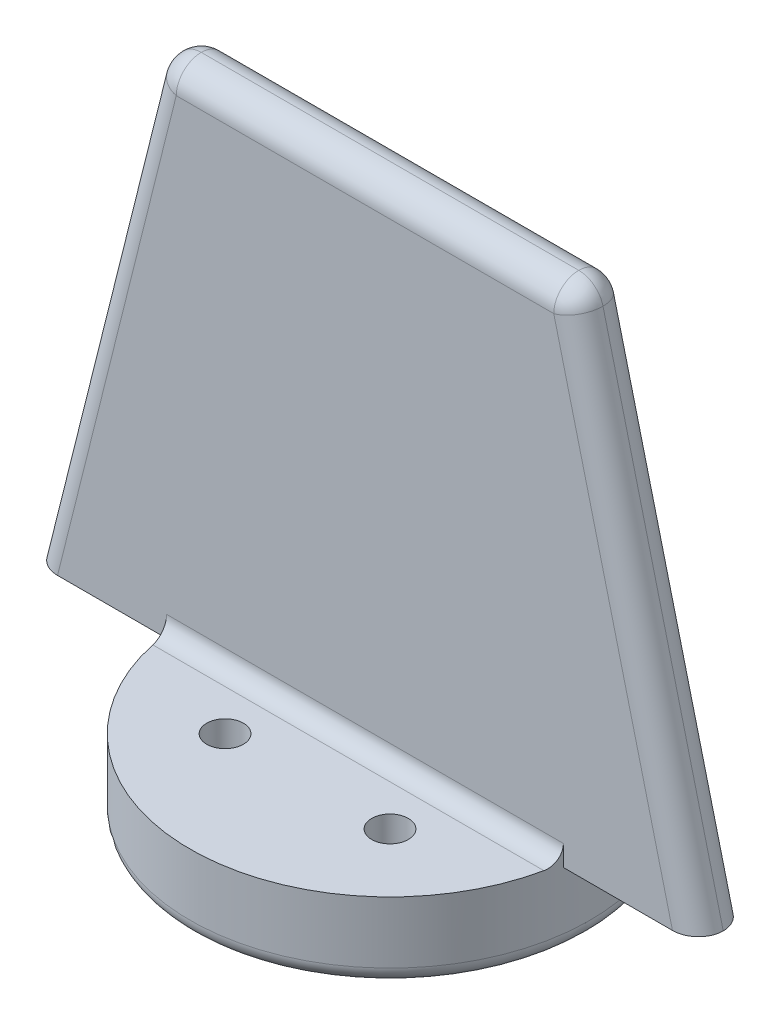
ISO-10303-21;
HEADER;
FILE_DESCRIPTION(('STEP AP214'),'2;1');
FILE_NAME('part.step','',(''),(''),'','','');
FILE_SCHEMA(('AUTOMOTIVE_DESIGN { 1 0 10303 214 1 1 1 1 }'));
ENDSEC;
DATA;
#1=APPLICATION_CONTEXT('core data for automotive mechanical design processes');
#2=APPLICATION_PROTOCOL_DEFINITION('international standard','automotive_design',2000,#1);
#3=PRODUCT_CONTEXT('',#1,'mechanical');
#4=PRODUCT('Part','Part','',(#3));
#5=PRODUCT_RELATED_PRODUCT_CATEGORY('part','',(#4));
#6=PRODUCT_DEFINITION_FORMATION('','',#4);
#7=PRODUCT_DEFINITION_CONTEXT('part definition',#1,'design');
#8=PRODUCT_DEFINITION('design','',#6,#7);
#9=PRODUCT_DEFINITION_SHAPE('','',#8);
#10=(LENGTH_UNIT() NAMED_UNIT(*) SI_UNIT(.MILLI.,.METRE.));
#11=(NAMED_UNIT(*) PLANE_ANGLE_UNIT() SI_UNIT($,.RADIAN.));
#12=(NAMED_UNIT(*) SI_UNIT($,.STERADIAN.) SOLID_ANGLE_UNIT());
#13=UNCERTAINTY_MEASURE_WITH_UNIT(LENGTH_MEASURE(1.E-05),#10,'distance_accuracy_value','');
#14=(GEOMETRIC_REPRESENTATION_CONTEXT(3) GLOBAL_UNCERTAINTY_ASSIGNED_CONTEXT((#13)) GLOBAL_UNIT_ASSIGNED_CONTEXT((#10,
#11,#12)) REPRESENTATION_CONTEXT('',''));
#15=CARTESIAN_POINT('',(0.,0.,0.));
#16=DIRECTION('',(0.,0.,1.));
#17=DIRECTION('',(1.,0.,0.));
#18=AXIS2_PLACEMENT_3D('',#15,#16,#17);
#19=CARTESIAN_POINT('',(0.,0.,0.));
#20=DIRECTION('',(0.,1.,0.));
#21=DIRECTION('',(0.,0.,1.));
#22=AXIS2_PLACEMENT_3D('',#19,#20,#21);
#23=PLANE('',#22);
#24=DIRECTION('',(1.,0.,0.));
#25=VECTOR('',#24,1.);
#26=CARTESIAN_POINT('',(-20.,0.,1.5));
#27=LINE('',#26,#25);
#28=CARTESIAN_POINT('',(11.9058808997907,0.,1.5));
#29=VERTEX_POINT('',#28);
#30=CARTESIAN_POINT('',(18.4538353903934,0.,1.5));
#31=VERTEX_POINT('',#30);
#32=EDGE_CURVE('E178',#29,#31,#27,.T.);
#33=ORIENTED_EDGE('',*,*,#32,.F.);
#34=CARTESIAN_POINT('',(0.,0.,0.));
#35=DIRECTION('',(0.,1.,0.));
#36=DIRECTION('',(0.,0.,1.));
#37=AXIS2_PLACEMENT_3D('',#34,#35,#36);
#38=CIRCLE('',#37,12.);
#39=CARTESIAN_POINT('',(11.9058808997907,0.,-1.5));
#40=VERTEX_POINT('',#39);
#41=EDGE_CURVE('E435',#29,#40,#38,.T.);
#42=ORIENTED_EDGE('',*,*,#41,.T.);
#43=DIRECTION('',(-1.,0.,0.));
#44=VECTOR('',#43,1.);
#45=CARTESIAN_POINT('',(-20.,0.,-1.5));
#46=LINE('',#45,#44);
#47=CARTESIAN_POINT('',(18.4538353903934,0.,-1.5));
#48=VERTEX_POINT('',#47);
#49=EDGE_CURVE('E165',#48,#40,#46,.T.);
#50=ORIENTED_EDGE('',*,*,#49,.F.);
#51=CARTESIAN_POINT('',(18.4538353903934,0.,0.));
#52=DIRECTION('',(0.,1.,0.));
#53=DIRECTION('',(-1.,0.,0.));
#54=AXIS2_PLACEMENT_3D('',#51,#52,#53);
#55=ELLIPSE('',#54,1.54616460960662,1.5);
#56=CARTESIAN_POINT('',(20.,0.,0.));
#57=VERTEX_POINT('',#56);
#58=EDGE_CURVE('E204',#48,#57,#55,.F.);
#59=ORIENTED_EDGE('',*,*,#58,.T.);
#60=CARTESIAN_POINT('',(18.4538353903934,0.,0.));
#61=DIRECTION('',(0.,1.,0.));
#62=DIRECTION('',(-1.,0.,0.));
#63=AXIS2_PLACEMENT_3D('',#60,#61,#62);
#64=ELLIPSE('',#63,1.54616460960662,1.5);
#65=EDGE_CURVE('E190',#57,#31,#64,.F.);
#66=ORIENTED_EDGE('',*,*,#65,.T.);
#67=EDGE_LOOP('',(#33,#42,#50,#59,#66));
#68=FACE_BOUND('',#67,.T.);
#69=ADVANCED_FACE('F56',(#68),#23,.F.);
#70=CARTESIAN_POINT('',(-11.9058808997907,0.,-1.5));
#71=VERTEX_POINT('',#70);
#72=CARTESIAN_POINT('',(-18.4538353903934,0.,-1.5));
#73=VERTEX_POINT('',#72);
#74=EDGE_CURVE('E177',#71,#73,#46,.T.);
#75=ORIENTED_EDGE('',*,*,#74,.F.);
#76=CARTESIAN_POINT('',(-11.9058808997907,0.,1.5));
#77=VERTEX_POINT('',#76);
#78=EDGE_CURVE('E175',#71,#77,#38,.T.);
#79=ORIENTED_EDGE('',*,*,#78,.T.);
#80=CARTESIAN_POINT('',(-18.4538353903934,0.,1.5));
#81=VERTEX_POINT('',#80);
#82=EDGE_CURVE('E157',#81,#77,#27,.T.);
#83=ORIENTED_EDGE('',*,*,#82,.F.);
#84=CARTESIAN_POINT('',(-18.4538353903934,0.,0.));
#85=DIRECTION('',(0.,1.,0.));
#86=DIRECTION('',(1.,0.,0.));
#87=AXIS2_PLACEMENT_3D('',#84,#85,#86);
#88=ELLIPSE('',#87,1.54616460960662,1.5);
#89=CARTESIAN_POINT('',(-20.,0.,0.));
#90=VERTEX_POINT('',#89);
#91=EDGE_CURVE('E172',#81,#90,#88,.F.);
#92=ORIENTED_EDGE('',*,*,#91,.T.);
#93=CARTESIAN_POINT('',(-18.4538353903934,0.,0.));
#94=DIRECTION('',(0.,1.,0.));
#95=DIRECTION('',(1.,0.,0.));
#96=AXIS2_PLACEMENT_3D('',#93,#94,#95);
#97=ELLIPSE('',#96,1.54616460960662,1.5);
#98=EDGE_CURVE('E185',#90,#73,#97,.F.);
#99=ORIENTED_EDGE('',*,*,#98,.T.);
#100=EDGE_LOOP('',(#75,#79,#83,#92,#99));
#101=FACE_BOUND('',#100,.T.);
#102=ADVANCED_FACE('F170',(#101),#23,.F.);
#103=CARTESIAN_POINT('',(0.,0.,-1.5));
#104=DIRECTION('',(0.,0.,1.));
#105=DIRECTION('',(1.,0.,0.));
#106=AXIS2_PLACEMENT_3D('',#103,#104,#105);
#107=PLANE('',#106);
#108=DIRECTION('',(0.,-1.,0.));
#109=VECTOR('',#108,1.);
#110=CARTESIAN_POINT('',(11.9058808997907,0.25,-1.5));
#111=LINE('',#110,#109);
#112=CARTESIAN_POINT('',(11.9058808997907,1.25,-1.5));
#113=VERTEX_POINT('',#112);
#114=EDGE_CURVE('E216',#40,#113,#111,.F.);
#115=ORIENTED_EDGE('',*,*,#114,.T.);
#116=DIRECTION('',(1.,0.,0.));
#117=VECTOR('',#116,1.);
#118=CARTESIAN_POINT('',(-11.9058808997907,1.25,-1.5));
#119=LINE('',#118,#117);
#120=CARTESIAN_POINT('',(-11.9058808997907,1.25,-1.5));
#121=VERTEX_POINT('',#120);
#122=EDGE_CURVE('E447',#113,#121,#119,.F.);
#123=ORIENTED_EDGE('',*,*,#122,.T.);
#124=DIRECTION('',(0.,-1.,0.));
#125=VECTOR('',#124,1.);
#126=CARTESIAN_POINT('',(-11.9058808997907,0.25,-1.5));
#127=LINE('',#126,#125);
#128=EDGE_CURVE('E429',#121,#71,#127,.T.);
#129=ORIENTED_EDGE('',*,*,#128,.T.);
#130=ORIENTED_EDGE('',*,*,#74,.T.);
#131=DIRECTION('',(0.242535625036333,0.970142500145332,0.));
#132=VECTOR('',#131,1.);
#133=CARTESIAN_POINT('',(-17.3683156615467,4.34207891538668,-1.5));
#134=LINE('',#133,#132);
#135=CARTESIAN_POINT('',(-11.3288353903934,28.5,-1.5));
#136=VERTEX_POINT('',#135);
#137=EDGE_CURVE('E514',#73,#136,#134,.T.);
#138=ORIENTED_EDGE('',*,*,#137,.T.);
#139=DIRECTION('',(-1.,0.,0.));
#140=VECTOR('',#139,1.);
#141=CARTESIAN_POINT('',(12.5,28.5,-1.5));
#142=LINE('',#141,#140);
#143=CARTESIAN_POINT('',(11.3288353903934,28.5,-1.5));
#144=VERTEX_POINT('',#143);
#145=EDGE_CURVE('E192',#136,#144,#142,.F.);
#146=ORIENTED_EDGE('',*,*,#145,.T.);
#147=DIRECTION('',(-0.242535625036333,0.970142500145332,0.));
#148=VECTOR('',#147,1.);
#149=CARTESIAN_POINT('',(17.3683156615467,4.34207891538668,-1.5));
#150=LINE('',#149,#148);
#151=EDGE_CURVE('E186',#144,#48,#150,.F.);
#152=ORIENTED_EDGE('',*,*,#151,.T.);
#153=ORIENTED_EDGE('',*,*,#49,.T.);
#154=EDGE_LOOP('',(#115,#123,#129,#130,#138,#146,#152,#153));
#155=FACE_BOUND('',#154,.T.);
#156=ADVANCED_FACE('F302',(#155),#107,.F.);
#157=CARTESIAN_POINT('',(0.,0.,1.5));
#158=DIRECTION('',(0.,0.,-1.));
#159=DIRECTION('',(-1.,0.,0.));
#160=AXIS2_PLACEMENT_3D('',#157,#158,#159);
#161=PLANE('',#160);
#162=DIRECTION('',(0.,-1.,0.));
#163=VECTOR('',#162,1.);
#164=CARTESIAN_POINT('',(-11.9058808997907,0.25,1.5));
#165=LINE('',#164,#163);
#166=CARTESIAN_POINT('',(-11.9058808997907,1.25,1.5));
#167=VERTEX_POINT('',#166);
#168=EDGE_CURVE('E75',#77,#167,#165,.F.);
#169=ORIENTED_EDGE('',*,*,#168,.T.);
#170=DIRECTION('',(-1.,0.,0.));
#171=VECTOR('',#170,1.);
#172=CARTESIAN_POINT('',(11.9058808997907,1.25,1.5));
#173=LINE('',#172,#171);
#174=CARTESIAN_POINT('',(11.9058808997907,1.25,1.5));
#175=VERTEX_POINT('',#174);
#176=EDGE_CURVE('E455',#167,#175,#173,.F.);
#177=ORIENTED_EDGE('',*,*,#176,.T.);
#178=DIRECTION('',(0.,-1.,0.));
#179=VECTOR('',#178,1.);
#180=CARTESIAN_POINT('',(11.9058808997907,0.25,1.5));
#181=LINE('',#180,#179);
#182=EDGE_CURVE('E82',#175,#29,#181,.T.);
#183=ORIENTED_EDGE('',*,*,#182,.T.);
#184=ORIENTED_EDGE('',*,*,#32,.T.);
#185=DIRECTION('',(-0.242535625036333,0.970142500145332,0.));
#186=VECTOR('',#185,1.);
#187=CARTESIAN_POINT('',(17.3683156615467,4.34207891538668,1.5));
#188=LINE('',#187,#186);
#189=CARTESIAN_POINT('',(11.3288353903934,28.5,1.5));
#190=VERTEX_POINT('',#189);
#191=EDGE_CURVE('E511',#31,#190,#188,.T.);
#192=ORIENTED_EDGE('',*,*,#191,.T.);
#193=DIRECTION('',(1.,0.,0.));
#194=VECTOR('',#193,1.);
#195=CARTESIAN_POINT('',(-12.5,28.5,1.5));
#196=LINE('',#195,#194);
#197=CARTESIAN_POINT('',(-11.3288353903934,28.5,1.5));
#198=VERTEX_POINT('',#197);
#199=EDGE_CURVE('E160',#190,#198,#196,.F.);
#200=ORIENTED_EDGE('',*,*,#199,.T.);
#201=DIRECTION('',(0.242535625036333,0.970142500145332,0.));
#202=VECTOR('',#201,1.);
#203=CARTESIAN_POINT('',(-17.3683156615467,4.34207891538668,1.5));
#204=LINE('',#203,#202);
#205=EDGE_CURVE('E154',#198,#81,#204,.F.);
#206=ORIENTED_EDGE('',*,*,#205,.T.);
#207=ORIENTED_EDGE('',*,*,#82,.T.);
#208=EDGE_LOOP('',(#169,#177,#183,#184,#192,#200,#206,#207));
#209=FACE_BOUND('',#208,.T.);
#210=ADVANCED_FACE('F156',(#209),#161,.F.);
#211=CARTESIAN_POINT('',(-17.3683156615467,4.34207891538668,0.));
#212=DIRECTION('',(0.242535625036333,0.970142500145332,0.));
#213=DIRECTION('',(-0.970142500145332,0.242535625036333,0.));
#214=AXIS2_PLACEMENT_3D('',#211,#212,#213);
#215=CYLINDRICAL_SURFACE('',#214,1.5);
#216=ORIENTED_EDGE('',*,*,#137,.F.);
#217=ORIENTED_EDGE('',*,*,#98,.F.);
#218=DIRECTION('',(0.242535625036333,0.970142500145332,0.));
#219=VECTOR('',#218,1.);
#220=CARTESIAN_POINT('',(-18.8235294117647,4.70588235294118,0.));
#221=LINE('',#220,#219);
#222=CARTESIAN_POINT('',(-12.7840491406114,28.8638034375545,0.));
#223=VERTEX_POINT('',#222);
#224=EDGE_CURVE('E183',#223,#90,#221,.F.);
#225=ORIENTED_EDGE('',*,*,#224,.F.);
#226=CARTESIAN_POINT('',(-11.3288353903934,28.5,0.));
#227=DIRECTION('',(0.242535625036332,0.970142500145332,0.));
#228=DIRECTION('',(-0.970142500145332,0.242535625036332,0.));
#229=AXIS2_PLACEMENT_3D('',#226,#227,#228);
#230=CIRCLE('',#229,1.5);
#231=EDGE_CURVE('E248',#136,#223,#230,.T.);
#232=ORIENTED_EDGE('',*,*,#231,.F.);
#233=EDGE_LOOP('',(#216,#217,#225,#232));
#234=FACE_BOUND('',#233,.T.);
#235=ADVANCED_FACE('F301',(#234),#215,.T.);
#236=CARTESIAN_POINT('',(17.3683156615467,4.34207891538668,0.));
#237=DIRECTION('',(-0.242535625036333,0.970142500145332,0.));
#238=DIRECTION('',(-0.970142500145332,-0.242535625036333,0.));
#239=AXIS2_PLACEMENT_3D('',#236,#237,#238);
#240=CYLINDRICAL_SURFACE('',#239,1.5);
#241=ORIENTED_EDGE('',*,*,#58,.F.);
#242=ORIENTED_EDGE('',*,*,#151,.F.);
#243=CARTESIAN_POINT('',(11.3288353903934,28.5,0.));
#244=DIRECTION('',(-0.242535625036333,0.970142500145332,0.));
#245=DIRECTION('',(-0.970142500145332,-0.242535625036333,0.));
#246=AXIS2_PLACEMENT_3D('',#243,#244,#245);
#247=CIRCLE('',#246,1.5);
#248=CARTESIAN_POINT('',(12.7840491406114,28.8638034375545,0.));
#249=VERTEX_POINT('',#248);
#250=EDGE_CURVE('E264',#249,#144,#247,.T.);
#251=ORIENTED_EDGE('',*,*,#250,.F.);
#252=DIRECTION('',(-0.242535625036333,0.970142500145332,0.));
#253=VECTOR('',#252,1.);
#254=CARTESIAN_POINT('',(18.8235294117647,4.70588235294118,0.));
#255=LINE('',#254,#253);
#256=EDGE_CURVE('E233',#57,#249,#255,.T.);
#257=ORIENTED_EDGE('',*,*,#256,.F.);
#258=EDGE_LOOP('',(#241,#242,#251,#257));
#259=FACE_BOUND('',#258,.T.);
#260=ADVANCED_FACE('F336',(#259),#240,.T.);
#261=CARTESIAN_POINT('',(-17.3683156615467,4.34207891538668,0.));
#262=DIRECTION('',(0.242535625036333,0.970142500145332,0.));
#263=DIRECTION('',(-0.970142500145332,0.242535625036333,0.));
#264=AXIS2_PLACEMENT_3D('',#261,#262,#263);
#265=CYLINDRICAL_SURFACE('',#264,1.5);
#266=CARTESIAN_POINT('',(-11.3288353903934,28.5,0.));
#267=DIRECTION('',(0.242535625036333,0.970142500145332,0.));
#268=DIRECTION('',(-0.970142500145332,0.242535625036333,0.));
#269=AXIS2_PLACEMENT_3D('',#266,#267,#268);
#270=CIRCLE('',#269,1.5);
#271=EDGE_CURVE('E238',#223,#198,#270,.T.);
#272=ORIENTED_EDGE('',*,*,#271,.F.);
#273=ORIENTED_EDGE('',*,*,#224,.T.);
#274=ORIENTED_EDGE('',*,*,#91,.F.);
#275=ORIENTED_EDGE('',*,*,#205,.F.);
#276=EDGE_LOOP('',(#272,#273,#274,#275));
#277=FACE_BOUND('',#276,.T.);
#278=ADVANCED_FACE('F182',(#277),#265,.T.);
#279=CARTESIAN_POINT('',(-11.3288353903934,28.5,0.));
#280=DIRECTION('',(0.,0.,-1.));
#281=DIRECTION('',(-1.,0.,0.));
#282=AXIS2_PLACEMENT_3D('',#279,#280,#281);
#283=SPHERICAL_SURFACE('',#282,1.5);
#284=ORIENTED_EDGE('',*,*,#231,.T.);
#285=CARTESIAN_POINT('',(-11.3288353903934,28.5,0.));
#286=DIRECTION('',(0.,0.,1.));
#287=DIRECTION('',(1.,0.,0.));
#288=AXIS2_PLACEMENT_3D('',#285,#286,#287);
#289=CIRCLE('',#288,1.5);
#290=CARTESIAN_POINT('',(-11.3288353903934,30.,0.));
#291=VERTEX_POINT('',#290);
#292=EDGE_CURVE('E232',#291,#223,#289,.T.);
#293=ORIENTED_EDGE('',*,*,#292,.F.);
#294=CARTESIAN_POINT('',(-11.3288353903934,28.5,0.));
#295=DIRECTION('',(-1.,0.,0.));
#296=DIRECTION('',(0.,0.,1.));
#297=AXIS2_PLACEMENT_3D('',#294,#295,#296);
#298=CIRCLE('',#297,1.5);
#299=EDGE_CURVE('E228',#136,#291,#298,.F.);
#300=ORIENTED_EDGE('',*,*,#299,.F.);
#301=EDGE_LOOP('',(#284,#293,#300));
#302=FACE_BOUND('',#301,.T.);
#303=ADVANCED_FACE('F329',(#302),#283,.T.);
#304=CARTESIAN_POINT('',(11.3288353903934,28.5,0.));
#305=DIRECTION('',(0.,0.,-1.));
#306=DIRECTION('',(-1.,0.,0.));
#307=AXIS2_PLACEMENT_3D('',#304,#305,#306);
#308=SPHERICAL_SURFACE('',#307,1.5);
#309=CARTESIAN_POINT('',(11.3288353903934,28.5,0.));
#310=DIRECTION('',(0.,0.,-1.));
#311=DIRECTION('',(-1.,0.,0.));
#312=AXIS2_PLACEMENT_3D('',#309,#310,#311);
#313=CIRCLE('',#312,1.5);
#314=CARTESIAN_POINT('',(11.3288353903934,30.,0.));
#315=VERTEX_POINT('',#314);
#316=EDGE_CURVE('E237',#249,#315,#313,.F.);
#317=ORIENTED_EDGE('',*,*,#316,.F.);
#318=ORIENTED_EDGE('',*,*,#250,.T.);
#319=CARTESIAN_POINT('',(11.3288353903934,28.5,0.));
#320=DIRECTION('',(1.,0.,0.));
#321=DIRECTION('',(0.,1.,0.));
#322=AXIS2_PLACEMENT_3D('',#319,#320,#321);
#323=CIRCLE('',#322,1.5);
#324=EDGE_CURVE('E224',#315,#144,#323,.F.);
#325=ORIENTED_EDGE('',*,*,#324,.F.);
#326=EDGE_LOOP('',(#317,#318,#325));
#327=FACE_BOUND('',#326,.T.);
#328=ADVANCED_FACE('F325',(#327),#308,.T.);
#329=CARTESIAN_POINT('',(17.3683156615467,4.34207891538668,0.));
#330=DIRECTION('',(-0.242535625036333,0.970142500145332,0.));
#331=DIRECTION('',(-0.970142500145332,-0.242535625036333,0.));
#332=AXIS2_PLACEMENT_3D('',#329,#330,#331);
#333=CYLINDRICAL_SURFACE('',#332,1.5);
#334=ORIENTED_EDGE('',*,*,#65,.F.);
#335=ORIENTED_EDGE('',*,*,#256,.T.);
#336=CARTESIAN_POINT('',(11.3288353903934,28.5,0.));
#337=DIRECTION('',(-0.242535625036332,0.970142500145332,0.));
#338=DIRECTION('',(-0.970142500145332,-0.242535625036332,0.));
#339=AXIS2_PLACEMENT_3D('',#336,#337,#338);
#340=CIRCLE('',#339,1.5);
#341=EDGE_CURVE('E223',#190,#249,#340,.T.);
#342=ORIENTED_EDGE('',*,*,#341,.F.);
#343=ORIENTED_EDGE('',*,*,#191,.F.);
#344=EDGE_LOOP('',(#334,#335,#342,#343));
#345=FACE_BOUND('',#344,.T.);
#346=ADVANCED_FACE('F321',(#345),#333,.T.);
#347=CARTESIAN_POINT('',(-11.3288353903934,28.5,0.));
#348=DIRECTION('',(0.,0.,1.));
#349=DIRECTION('',(1.,0.,0.));
#350=AXIS2_PLACEMENT_3D('',#347,#348,#349);
#351=SPHERICAL_SURFACE('',#350,1.5);
#352=ORIENTED_EDGE('',*,*,#292,.T.);
#353=ORIENTED_EDGE('',*,*,#271,.T.);
#354=CARTESIAN_POINT('',(-11.3288353903934,28.5,0.));
#355=DIRECTION('',(-1.,0.,0.));
#356=DIRECTION('',(0.,-1.,0.));
#357=AXIS2_PLACEMENT_3D('',#354,#355,#356);
#358=CIRCLE('',#357,1.5);
#359=EDGE_CURVE('E220',#291,#198,#358,.F.);
#360=ORIENTED_EDGE('',*,*,#359,.F.);
#361=EDGE_LOOP('',(#352,#353,#360));
#362=FACE_BOUND('',#361,.T.);
#363=ADVANCED_FACE('F317',(#362),#351,.T.);
#364=CARTESIAN_POINT('',(0.,28.5,0.));
#365=DIRECTION('',(1.,0.,0.));
#366=DIRECTION('',(0.,0.,-1.));
#367=AXIS2_PLACEMENT_3D('',#364,#365,#366);
#368=CYLINDRICAL_SURFACE('',#367,1.5);
#369=ORIENTED_EDGE('',*,*,#145,.F.);
#370=ORIENTED_EDGE('',*,*,#299,.T.);
#371=DIRECTION('',(-1.,0.,0.));
#372=VECTOR('',#371,1.);
#373=CARTESIAN_POINT('',(-12.5,30.,0.));
#374=LINE('',#373,#372);
#375=EDGE_CURVE('E215',#315,#291,#374,.T.);
#376=ORIENTED_EDGE('',*,*,#375,.F.);
#377=ORIENTED_EDGE('',*,*,#324,.T.);
#378=EDGE_LOOP('',(#369,#370,#376,#377));
#379=FACE_BOUND('',#378,.T.);
#380=ADVANCED_FACE('F313',(#379),#368,.T.);
#381=CARTESIAN_POINT('',(11.3288353903934,28.5,0.));
#382=DIRECTION('',(0.,0.,1.));
#383=DIRECTION('',(1.,0.,0.));
#384=AXIS2_PLACEMENT_3D('',#381,#382,#383);
#385=SPHERICAL_SURFACE('',#384,1.5);
#386=ORIENTED_EDGE('',*,*,#341,.T.);
#387=ORIENTED_EDGE('',*,*,#316,.T.);
#388=CARTESIAN_POINT('',(11.3288353903934,28.5,0.));
#389=DIRECTION('',(1.,0.,0.));
#390=DIRECTION('',(0.,0.,-1.));
#391=AXIS2_PLACEMENT_3D('',#388,#389,#390);
#392=CIRCLE('',#391,1.5);
#393=EDGE_CURVE('E211',#190,#315,#392,.F.);
#394=ORIENTED_EDGE('',*,*,#393,.F.);
#395=EDGE_LOOP('',(#386,#387,#394));
#396=FACE_BOUND('',#395,.T.);
#397=ADVANCED_FACE('F309',(#396),#385,.T.);
#398=CARTESIAN_POINT('',(0.,28.5,0.));
#399=DIRECTION('',(-1.,0.,0.));
#400=DIRECTION('',(0.,0.,1.));
#401=AXIS2_PLACEMENT_3D('',#398,#399,#400);
#402=CYLINDRICAL_SURFACE('',#401,1.5);
#403=ORIENTED_EDGE('',*,*,#359,.T.);
#404=ORIENTED_EDGE('',*,*,#199,.F.);
#405=ORIENTED_EDGE('',*,*,#393,.T.);
#406=ORIENTED_EDGE('',*,*,#375,.T.);
#407=EDGE_LOOP('',(#403,#404,#405,#406));
#408=FACE_BOUND('',#407,.T.);
#409=ADVANCED_FACE('F305',(#408),#402,.T.);
#410=CARTESIAN_POINT('',(0.,0.25,0.));
#411=DIRECTION('',(0.,-1.,0.));
#412=DIRECTION('',(0.,0.,-1.));
#413=AXIS2_PLACEMENT_3D('',#410,#411,#412);
#414=CYLINDRICAL_SURFACE('',#413,12.);
#415=CARTESIAN_POINT('',(0.,-3.45,0.));
#416=DIRECTION('',(0.,-1.,0.));
#417=DIRECTION('',(0.,0.,-1.));
#418=AXIS2_PLACEMENT_3D('',#415,#416,#417);
#419=CIRCLE('',#418,12.);
#420=CARTESIAN_POINT('',(0.,-3.45,-12.));
#421=VERTEX_POINT('',#420);
#422=EDGE_CURVE('E464',#421,#421,#419,.F.);
#423=ORIENTED_EDGE('',*,*,#422,.T.);
#424=EDGE_LOOP('',(#423));
#425=FACE_BOUND('',#424,.T.);
#426=ORIENTED_EDGE('',*,*,#114,.F.);
#427=ORIENTED_EDGE('',*,*,#41,.F.);
#428=ORIENTED_EDGE('',*,*,#182,.F.);
#429=CARTESIAN_POINT('',(11.9058808997907,1.25,1.5));
#430=CARTESIAN_POINT('',(11.9058803219719,1.22205934163317,1.50000007829664));
#431=CARTESIAN_POINT('',(11.9057333343807,1.19413208963107,1.50117176931848));
#432=CARTESIAN_POINT('',(11.9051433358163,1.13847795305902,1.50584539028658));
#433=CARTESIAN_POINT('',(11.9047003408256,1.11075105775283,1.50934719442226));
#434=CARTESIAN_POINT('',(11.9029246155717,1.02822425267649,1.52331197780174));
#435=CARTESIAN_POINT('',(11.9011451638572,0.973978019289925,1.53723443440069));
#436=CARTESIAN_POINT('',(11.8963514930938,0.868614891744787,1.57389925906644));
#437=CARTESIAN_POINT('',(11.8933367150576,0.817499426316313,1.59664561971723));
#438=CARTESIAN_POINT('',(11.8860134200411,0.719837555240657,1.65027711057949));
#439=CARTESIAN_POINT('',(11.8817050959263,0.673290469827585,1.68116102741113));
#440=CARTESIAN_POINT('',(11.8717306452732,0.585985730172737,1.75020757404077));
#441=CARTESIAN_POINT('',(11.8660621287416,0.545238469852109,1.78838299136852));
#442=CARTESIAN_POINT('',(11.8533401509418,0.470735715161327,1.87084581994263));
#443=CARTESIAN_POINT('',(11.8462864821446,0.436981270041609,1.9151341467535));
#444=CARTESIAN_POINT('',(11.8307571284401,0.377142833224259,2.00884418399206));
#445=CARTESIAN_POINT('',(11.8222716447478,0.351115361333545,2.05830030663343));
#446=CARTESIAN_POINT('',(11.8039961628101,0.307703492596219,2.16064144415876));
#447=CARTESIAN_POINT('',(11.7942065003078,0.290316876709795,2.2135255747556));
#448=CARTESIAN_POINT('',(11.7765010506871,0.268301412520571,2.30554488053525));
#449=CARTESIAN_POINT('',(11.7688660812159,0.261434373237741,2.34421555548668));
#450=CARTESIAN_POINT('',(11.753119583035,0.252284076838309,2.42193491998216));
#451=CARTESIAN_POINT('',(11.7450088349627,0.249993516025315,2.46098290711082));
#452=CARTESIAN_POINT('',(11.7366945943055,0.25,2.5));
#453=B_SPLINE_CURVE_WITH_KNOTS('',3,(#429,#430,#431,#432,#433,#434,#435,#436,#437,#438,#439,
#440,#441,#442,#443,#444,#445,#446,#447,#448,#449,#450,#451,#452),.UNSPECIFIED.,.F.,.F.,(4,2,2,
2,2,2,2,2,2,2,2,4),(0.,0.0837704102948457,0.167536297913176,0.33477129233307,0.502082044605907,
0.669367863505841,0.836949800798664,1.00455686506324,1.17336130126301,1.3421223647258,
1.46190144896381,1.58148922210985),.UNSPECIFIED.);
#454=CARTESIAN_POINT('',(11.7366945943055,0.25,2.5));
#455=VERTEX_POINT('',#454);
#456=EDGE_CURVE('E12',#175,#455,#453,.T.);
#457=ORIENTED_EDGE('',*,*,#456,.T.);
#458=CARTESIAN_POINT('',(0.,0.25,0.));
#459=DIRECTION('',(0.,-1.,0.));
#460=DIRECTION('',(0.,0.,-1.));
#461=AXIS2_PLACEMENT_3D('',#458,#459,#460);
#462=CIRCLE('',#461,12.);
#463=CARTESIAN_POINT('',(-11.7366945943055,0.25,2.5));
#464=VERTEX_POINT('',#463);
#465=EDGE_CURVE('E426',#455,#464,#462,.T.);
#466=ORIENTED_EDGE('',*,*,#465,.T.);
#467=CARTESIAN_POINT('',(-11.7366945943055,0.25,2.5));
#468=CARTESIAN_POINT('',(-11.7427049934861,0.250000467923372,2.47178579174582));
#469=CARTESIAN_POINT('',(-11.7486097458622,0.251194854573783,2.44356225060722));
#470=CARTESIAN_POINT('',(-11.7601777595555,0.255972685126126,2.38726687335702));
#471=CARTESIAN_POINT('',(-11.765841007387,0.259556262255696,2.35919504579336));
#472=CARTESIAN_POINT('',(-11.7824119298979,0.273883527920906,2.27551932595292));
#473=CARTESIAN_POINT('',(-11.7929120680015,0.288203751443974,2.22040211675762));
#474=CARTESIAN_POINT('',(-11.812600822398,0.326097267212637,2.11316006706677));
#475=CARTESIAN_POINT('',(-11.8217881311987,0.349679697614094,2.06103824023027));
#476=CARTESIAN_POINT('',(-11.8387247513433,0.405498719299101,1.96141501083505));
#477=CARTESIAN_POINT('',(-11.8464747283362,0.437731287570015,1.91391147435382));
#478=CARTESIAN_POINT('',(-11.8604000194753,0.509459065690689,1.82561923779759));
#479=CARTESIAN_POINT('',(-11.8665960656893,0.548845041553487,1.78474502491754));
#480=CARTESIAN_POINT('',(-11.8775754292808,0.634085708292833,1.71015411801405));
#481=CARTESIAN_POINT('',(-11.882358452047,0.679941745217686,1.67643891703542));
#482=CARTESIAN_POINT('',(-11.8905119528114,0.776187407026471,1.61759094957577));
#483=CARTESIAN_POINT('',(-11.8938991276078,0.826514129477812,1.59235744378236));
#484=CARTESIAN_POINT('',(-11.8994050775472,0.930731157378293,1.550678517099));
#485=CARTESIAN_POINT('',(-11.9015247433083,0.984618931010663,1.53422692645111));
#486=CARTESIAN_POINT('',(-11.9039887669093,1.07406597340965,1.51496100709254));
#487=CARTESIAN_POINT('',(-11.9046997173841,1.10903878353772,1.50935374466898));
#488=CARTESIAN_POINT('',(-11.9056448213656,1.17933595376875,1.50187408450956));
#489=CARTESIAN_POINT('',(-11.9058796721771,1.21465972348248,1.4999962247008));
#490=CARTESIAN_POINT('',(-11.9058808997907,1.25,1.5));
#491=B_SPLINE_CURVE_WITH_KNOTS('',3,(#467,#468,#469,#470,#471,#472,#473,#474,#475,#476,#477,
#478,#479,#480,#481,#482,#483,#484,#485,#486,#487,#488,#489,#490),.UNSPECIFIED.,.F.,.F.,(4,2,2,
2,2,2,2,2,2,2,2,4),(0.,0.0864908144352909,0.172986452232615,0.34581696934616,0.518818432287309,
0.691739574598013,0.862213588230627,1.03272312015741,1.20112931084527,1.36941703107628,
1.47551046211687,1.58144839407905),.UNSPECIFIED.);
#492=EDGE_CURVE('E67',#464,#167,#491,.T.);
#493=ORIENTED_EDGE('',*,*,#492,.T.);
#494=ORIENTED_EDGE('',*,*,#168,.F.);
#495=ORIENTED_EDGE('',*,*,#78,.F.);
#496=ORIENTED_EDGE('',*,*,#128,.F.);
#497=CARTESIAN_POINT('',(-11.9058808997907,1.25,-1.5));
#498=CARTESIAN_POINT('',(-11.9058803219719,1.22205934163317,-1.50000007829664));
#499=CARTESIAN_POINT('',(-11.9057333343807,1.19413208963107,-1.50117176931848));
#500=CARTESIAN_POINT('',(-11.9051433358163,1.13847795305902,-1.50584539028658));
#501=CARTESIAN_POINT('',(-11.9047003408256,1.11075105775283,-1.50934719442226));
#502=CARTESIAN_POINT('',(-11.9029246155717,1.02822425267649,-1.52331197780174));
#503=CARTESIAN_POINT('',(-11.9011451638572,0.973978019289925,-1.53723443440069));
#504=CARTESIAN_POINT('',(-11.8963514930938,0.868614891744787,-1.57389925906644));
#505=CARTESIAN_POINT('',(-11.8933367150576,0.817499426316313,-1.59664561971723));
#506=CARTESIAN_POINT('',(-11.8860134200411,0.719837555240657,-1.65027711057949));
#507=CARTESIAN_POINT('',(-11.8817050959263,0.673290469827585,-1.68116102741113));
#508=CARTESIAN_POINT('',(-11.8717306452732,0.585985730172737,-1.75020757404077));
#509=CARTESIAN_POINT('',(-11.8660621287416,0.545238469852109,-1.78838299136852));
#510=CARTESIAN_POINT('',(-11.8533401509418,0.470735715161327,-1.87084581994263));
#511=CARTESIAN_POINT('',(-11.8462864821446,0.436981270041609,-1.9151341467535));
#512=CARTESIAN_POINT('',(-11.8307571284401,0.377142833224259,-2.00884418399206));
#513=CARTESIAN_POINT('',(-11.8222716447478,0.351115361333545,-2.05830030663343));
#514=CARTESIAN_POINT('',(-11.8039961628101,0.307703492596219,-2.16064144415876));
#515=CARTESIAN_POINT('',(-11.7942065003078,0.290316876709795,-2.2135255747556));
#516=CARTESIAN_POINT('',(-11.7765010506871,0.268301412520571,-2.30554488053525));
#517=CARTESIAN_POINT('',(-11.7688660812159,0.261434373237741,-2.34421555548668));
#518=CARTESIAN_POINT('',(-11.753119583035,0.252284076838309,-2.42193491998216));
#519=CARTESIAN_POINT('',(-11.7450088349627,0.249993516025315,-2.46098290711082));
#520=CARTESIAN_POINT('',(-11.7366945943055,0.25,-2.5));
#521=B_SPLINE_CURVE_WITH_KNOTS('',3,(#497,#498,#499,#500,#501,#502,#503,#504,#505,#506,#507,
#508,#509,#510,#511,#512,#513,#514,#515,#516,#517,#518,#519,#520),.UNSPECIFIED.,.F.,.F.,(4,2,2,
2,2,2,2,2,2,2,2,4),(0.,0.0837704102948457,0.167536297913176,0.33477129233307,0.502082044605907,
0.669367863505841,0.836949800798664,1.00455686506324,1.17336130126301,1.3421223647258,
1.46190144896381,1.58148922210985),.UNSPECIFIED.);
#522=CARTESIAN_POINT('',(-11.7366945943055,0.25,-2.5));
#523=VERTEX_POINT('',#522);
#524=EDGE_CURVE('E361',#121,#523,#521,.T.);
#525=ORIENTED_EDGE('',*,*,#524,.T.);
#526=CARTESIAN_POINT('',(11.7366945943055,0.25,-2.5));
#527=VERTEX_POINT('',#526);
#528=EDGE_CURVE('E419',#523,#527,#462,.T.);
#529=ORIENTED_EDGE('',*,*,#528,.T.);
#530=CARTESIAN_POINT('',(11.7366945943055,0.25,-2.5));
#531=CARTESIAN_POINT('',(11.7427049934861,0.250000467923372,-2.47178579174582));
#532=CARTESIAN_POINT('',(11.7486097458622,0.251194854573783,-2.44356225060722));
#533=CARTESIAN_POINT('',(11.7601777595555,0.255972685126126,-2.38726687335702));
#534=CARTESIAN_POINT('',(11.765841007387,0.259556262255696,-2.35919504579336));
#535=CARTESIAN_POINT('',(11.7824119298979,0.273883527920906,-2.27551932595292));
#536=CARTESIAN_POINT('',(11.7929120680015,0.288203751443974,-2.22040211675762));
#537=CARTESIAN_POINT('',(11.812600822398,0.326097267212637,-2.11316006706677));
#538=CARTESIAN_POINT('',(11.8217881311987,0.349679697614094,-2.06103824023027));
#539=CARTESIAN_POINT('',(11.8387247513433,0.405498719299101,-1.96141501083505));
#540=CARTESIAN_POINT('',(11.8464747283362,0.437731287570015,-1.91391147435382));
#541=CARTESIAN_POINT('',(11.8604000194753,0.509459065690689,-1.82561923779759));
#542=CARTESIAN_POINT('',(11.8665960656893,0.548845041553487,-1.78474502491754));
#543=CARTESIAN_POINT('',(11.8775754292808,0.634085708292833,-1.71015411801405));
#544=CARTESIAN_POINT('',(11.882358452047,0.679941745217686,-1.67643891703542));
#545=CARTESIAN_POINT('',(11.8905119528114,0.776187407026471,-1.61759094957577));
#546=CARTESIAN_POINT('',(11.8938991276078,0.826514129477812,-1.59235744378236));
#547=CARTESIAN_POINT('',(11.8994050775472,0.930731157378293,-1.550678517099));
#548=CARTESIAN_POINT('',(11.9015247433083,0.984618931010663,-1.53422692645111));
#549=CARTESIAN_POINT('',(11.9039887669093,1.07406597340965,-1.51496100709254));
#550=CARTESIAN_POINT('',(11.9046997173841,1.10903878353772,-1.50935374466898));
#551=CARTESIAN_POINT('',(11.9056448213656,1.17933595376875,-1.50187408450956));
#552=CARTESIAN_POINT('',(11.9058796721771,1.21465972348248,-1.4999962247008));
#553=CARTESIAN_POINT('',(11.9058808997907,1.25,-1.5));
#554=B_SPLINE_CURVE_WITH_KNOTS('',3,(#530,#531,#532,#533,#534,#535,#536,#537,#538,#539,#540,
#541,#542,#543,#544,#545,#546,#547,#548,#549,#550,#551,#552,#553),.UNSPECIFIED.,.F.,.F.,(4,2,2,
2,2,2,2,2,2,2,2,4),(0.,0.0864908144352909,0.172986452232615,0.34581696934616,0.518818432287309,
0.691739574598013,0.862213588230627,1.03272312015741,1.20112931084527,1.36941703107628,
1.47551046211687,1.58144839407905),.UNSPECIFIED.);
#555=EDGE_CURVE('E353',#527,#113,#554,.T.);
#556=ORIENTED_EDGE('',*,*,#555,.T.);
#557=EDGE_LOOP('',(#426,#427,#428,#457,#466,#493,#494,#495,#496,#525,#529,#556));
#558=FACE_BOUND('',#557,.T.);
#559=ADVANCED_FACE('F308',(#425,#558),#414,.T.);
#560=CARTESIAN_POINT('',(0.,0.25,0.));
#561=DIRECTION('',(0.,-1.,0.));
#562=DIRECTION('',(0.,0.,-1.));
#563=AXIS2_PLACEMENT_3D('',#560,#561,#562);
#564=PLANE('',#563);
#565=CARTESIAN_POINT('',(-4.94974746830579,0.25,-4.94974746830588));
#566=DIRECTION('',(0.,1.,0.));
#567=DIRECTION('',(1.,0.,0.));
#568=AXIS2_PLACEMENT_3D('',#565,#566,#567);
#569=CIRCLE('',#568,1.1);
#570=CARTESIAN_POINT('',(-3.84974746830579,0.25,-4.94974746830586));
#571=VERTEX_POINT('',#570);
#572=EDGE_CURVE('E413',#571,#571,#569,.T.);
#573=ORIENTED_EDGE('',*,*,#572,.F.);
#574=EDGE_LOOP('',(#573));
#575=FACE_BOUND('',#574,.T.);
#576=CARTESIAN_POINT('',(4.94974746830582,0.25,-4.94974746830584));
#577=DIRECTION('',(0.,1.,0.));
#578=DIRECTION('',(0.,0.,1.));
#579=AXIS2_PLACEMENT_3D('',#576,#577,#578);
#580=CIRCLE('',#579,1.1);
#581=CARTESIAN_POINT('',(4.94974746830582,0.25,-3.84974746830584));
#582=VERTEX_POINT('',#581);
#583=EDGE_CURVE('E392',#582,#582,#580,.T.);
#584=ORIENTED_EDGE('',*,*,#583,.F.);
#585=EDGE_LOOP('',(#584));
#586=FACE_BOUND('',#585,.T.);
#587=ORIENTED_EDGE('',*,*,#528,.F.);
#588=DIRECTION('',(1.,0.,0.));
#589=VECTOR('',#588,1.);
#590=CARTESIAN_POINT('',(11.9058808997907,0.25,-2.5));
#591=LINE('',#590,#589);
#592=EDGE_CURVE('E458',#523,#527,#591,.T.);
#593=ORIENTED_EDGE('',*,*,#592,.T.);
#594=EDGE_LOOP('',(#587,#593));
#595=FACE_BOUND('',#594,.T.);
#596=ADVANCED_FACE('F375',(#575,#586,#595),#564,.F.);
#597=CARTESIAN_POINT('',(4.94974746830582,0.25,4.94974746830584));
#598=DIRECTION('',(0.,1.,0.));
#599=DIRECTION('',(-1.,0.,0.));
#600=AXIS2_PLACEMENT_3D('',#597,#598,#599);
#601=CIRCLE('',#600,1.1);
#602=CARTESIAN_POINT('',(3.84974746830582,0.25,4.94974746830584));
#603=VERTEX_POINT('',#602);
#604=EDGE_CURVE('E397',#603,#603,#601,.T.);
#605=ORIENTED_EDGE('',*,*,#604,.F.);
#606=EDGE_LOOP('',(#605));
#607=FACE_BOUND('',#606,.T.);
#608=CARTESIAN_POINT('',(-4.94974746830582,0.25,4.94974746830584));
#609=DIRECTION('',(0.,1.,0.));
#610=DIRECTION('',(0.,0.,-1.));
#611=AXIS2_PLACEMENT_3D('',#608,#609,#610);
#612=CIRCLE('',#611,1.1);
#613=CARTESIAN_POINT('',(-4.94974746830582,0.25,3.84974746830584));
#614=VERTEX_POINT('',#613);
#615=EDGE_CURVE('E738',#614,#614,#612,.T.);
#616=ORIENTED_EDGE('',*,*,#615,.F.);
#617=EDGE_LOOP('',(#616));
#618=FACE_BOUND('',#617,.T.);
#619=ORIENTED_EDGE('',*,*,#465,.F.);
#620=DIRECTION('',(-1.,0.,0.));
#621=VECTOR('',#620,1.);
#622=CARTESIAN_POINT('',(-11.9058808997907,0.25,2.5));
#623=LINE('',#622,#621);
#624=EDGE_CURVE('E457',#455,#464,#623,.T.);
#625=ORIENTED_EDGE('',*,*,#624,.T.);
#626=EDGE_LOOP('',(#619,#625));
#627=FACE_BOUND('',#626,.T.);
#628=ADVANCED_FACE('F475',(#607,#618,#627),#564,.F.);
#629=CARTESIAN_POINT('',(0.,-4.45,0.));
#630=DIRECTION('',(0.,-1.,0.));
#631=DIRECTION('',(0.,0.,-1.));
#632=AXIS2_PLACEMENT_3D('',#629,#630,#631);
#633=PLANE('',#632);
#634=CARTESIAN_POINT('',(0.,-4.45,0.));
#635=DIRECTION('',(0.,-1.,0.));
#636=DIRECTION('',(0.,0.,-1.));
#637=AXIS2_PLACEMENT_3D('',#634,#635,#636);
#638=CIRCLE('',#637,10.);
#639=CARTESIAN_POINT('',(0.,-4.45,-10.));
#640=VERTEX_POINT('',#639);
#641=EDGE_CURVE('E391',#640,#640,#638,.T.);
#642=ORIENTED_EDGE('',*,*,#641,.F.);
#643=EDGE_LOOP('',(#642));
#644=FACE_BOUND('',#643,.T.);
#645=CARTESIAN_POINT('',(0.,-4.45,0.));
#646=DIRECTION('',(0.,-1.,0.));
#647=DIRECTION('',(0.,0.,-1.));
#648=AXIS2_PLACEMENT_3D('',#645,#646,#647);
#649=CIRCLE('',#648,11.);
#650=CARTESIAN_POINT('',(0.,-4.45,-11.));
#651=VERTEX_POINT('',#650);
#652=EDGE_CURVE('E486',#651,#651,#649,.T.);
#653=ORIENTED_EDGE('',*,*,#652,.T.);
#654=EDGE_LOOP('',(#653));
#655=FACE_BOUND('',#654,.T.);
#656=ADVANCED_FACE('F346',(#644,#655),#633,.T.);
#657=CARTESIAN_POINT('',(0.,-3.45,0.));
#658=DIRECTION('',(0.,-1.,0.));
#659=DIRECTION('',(0.,0.,-1.));
#660=AXIS2_PLACEMENT_3D('',#657,#658,#659);
#661=TOROIDAL_SURFACE('',#660,11.,1.);
#662=ORIENTED_EDGE('',*,*,#422,.F.);
#663=EDGE_LOOP('',(#662));
#664=FACE_BOUND('',#663,.T.);
#665=ORIENTED_EDGE('',*,*,#652,.F.);
#666=EDGE_LOOP('',(#665));
#667=FACE_BOUND('',#666,.T.);
#668=ADVANCED_FACE('F343',(#664,#667),#661,.T.);
#669=CARTESIAN_POINT('',(0.,1.25,-2.5));
#670=DIRECTION('',(-1.,0.,0.));
#671=DIRECTION('',(0.,0.,1.));
#672=AXIS2_PLACEMENT_3D('',#669,#670,#671);
#673=CYLINDRICAL_SURFACE('',#672,1.);
#674=ORIENTED_EDGE('',*,*,#524,.F.);
#675=ORIENTED_EDGE('',*,*,#122,.F.);
#676=ORIENTED_EDGE('',*,*,#555,.F.);
#677=ORIENTED_EDGE('',*,*,#592,.F.);
#678=EDGE_LOOP('',(#674,#675,#676,#677));
#679=FACE_BOUND('',#678,.T.);
#680=ADVANCED_FACE('F345',(#679),#673,.F.);
#681=CARTESIAN_POINT('',(0.,1.25,2.5));
#682=DIRECTION('',(1.,0.,0.));
#683=DIRECTION('',(0.,0.,-1.));
#684=AXIS2_PLACEMENT_3D('',#681,#682,#683);
#685=CYLINDRICAL_SURFACE('',#684,1.);
#686=ORIENTED_EDGE('',*,*,#456,.F.);
#687=ORIENTED_EDGE('',*,*,#176,.F.);
#688=ORIENTED_EDGE('',*,*,#492,.F.);
#689=ORIENTED_EDGE('',*,*,#624,.F.);
#690=EDGE_LOOP('',(#686,#687,#688,#689));
#691=FACE_BOUND('',#690,.T.);
#692=ADVANCED_FACE('F58',(#691),#685,.F.);
#693=CARTESIAN_POINT('',(0.,-2.,0.));
#694=DIRECTION('',(0.,-1.,0.));
#695=DIRECTION('',(0.,0.,-1.));
#696=AXIS2_PLACEMENT_3D('',#693,#694,#695);
#697=CYLINDRICAL_SURFACE('',#696,10.);
#698=CARTESIAN_POINT('',(0.,-2.,0.));
#699=DIRECTION('',(0.,-1.,0.));
#700=DIRECTION('',(0.,0.,-1.));
#701=AXIS2_PLACEMENT_3D('',#698,#699,#700);
#702=CIRCLE('',#701,10.);
#703=CARTESIAN_POINT('',(0.,-2.,-10.));
#704=VERTEX_POINT('',#703);
#705=EDGE_CURVE('E415',#704,#704,#702,.T.);
#706=ORIENTED_EDGE('',*,*,#705,.F.);
#707=EDGE_LOOP('',(#706));
#708=FACE_BOUND('',#707,.T.);
#709=ORIENTED_EDGE('',*,*,#641,.T.);
#710=EDGE_LOOP('',(#709));
#711=FACE_BOUND('',#710,.T.);
#712=ADVANCED_FACE('F580',(#708,#711),#697,.F.);
#713=CARTESIAN_POINT('',(0.,-2.,0.));
#714=DIRECTION('',(0.,-1.,0.));
#715=DIRECTION('',(0.,0.,-1.));
#716=AXIS2_PLACEMENT_3D('',#713,#714,#715);
#717=PLANE('',#716);
#718=CARTESIAN_POINT('',(4.94974746830582,-2.,4.94974746830584));
#719=DIRECTION('',(0.,-1.,0.));
#720=DIRECTION('',(0.,0.,-1.));
#721=AXIS2_PLACEMENT_3D('',#718,#719,#720);
#722=CIRCLE('',#721,1.1);
#723=CARTESIAN_POINT('',(4.94974746830582,-2.,3.84974746830584));
#724=VERTEX_POINT('',#723);
#725=EDGE_CURVE('E61',#724,#724,#722,.T.);
#726=ORIENTED_EDGE('',*,*,#725,.F.);
#727=EDGE_LOOP('',(#726));
#728=FACE_BOUND('',#727,.T.);
#729=CARTESIAN_POINT('',(-4.94974746830582,-2.,4.94974746830584));
#730=DIRECTION('',(0.,-1.,0.));
#731=DIRECTION('',(0.,0.,-1.));
#732=AXIS2_PLACEMENT_3D('',#729,#730,#731);
#733=CIRCLE('',#732,1.1);
#734=CARTESIAN_POINT('',(-4.94974746830582,-2.,3.84974746830584));
#735=VERTEX_POINT('',#734);
#736=EDGE_CURVE('E396',#735,#735,#733,.T.);
#737=ORIENTED_EDGE('',*,*,#736,.F.);
#738=EDGE_LOOP('',(#737));
#739=FACE_BOUND('',#738,.T.);
#740=CARTESIAN_POINT('',(-4.94974746830579,-2.,-4.94974746830588));
#741=DIRECTION('',(0.,-1.,0.));
#742=DIRECTION('',(0.,0.,-1.));
#743=AXIS2_PLACEMENT_3D('',#740,#741,#742);
#744=CIRCLE('',#743,1.1);
#745=CARTESIAN_POINT('',(-4.94974746830579,-2.,-6.04974746830588));
#746=VERTEX_POINT('',#745);
#747=EDGE_CURVE('E393',#746,#746,#744,.T.);
#748=ORIENTED_EDGE('',*,*,#747,.F.);
#749=EDGE_LOOP('',(#748));
#750=FACE_BOUND('',#749,.T.);
#751=CARTESIAN_POINT('',(4.94974746830582,-2.,-4.94974746830584));
#752=DIRECTION('',(0.,-1.,0.));
#753=DIRECTION('',(0.,0.,-1.));
#754=AXIS2_PLACEMENT_3D('',#751,#752,#753);
#755=CIRCLE('',#754,1.1);
#756=CARTESIAN_POINT('',(4.94974746830582,-2.,-6.04974746830584));
#757=VERTEX_POINT('',#756);
#758=EDGE_CURVE('E387',#757,#757,#755,.T.);
#759=ORIENTED_EDGE('',*,*,#758,.F.);
#760=EDGE_LOOP('',(#759));
#761=FACE_BOUND('',#760,.T.);
#762=ORIENTED_EDGE('',*,*,#705,.T.);
#763=EDGE_LOOP('',(#762));
#764=FACE_BOUND('',#763,.T.);
#765=ADVANCED_FACE('F594',(#728,#739,#750,#761,#764),#717,.T.);
#766=CARTESIAN_POINT('',(4.94974746830582,-4.45,-4.94974746830584));
#767=DIRECTION('',(0.,1.,0.));
#768=DIRECTION('',(0.,0.,1.));
#769=AXIS2_PLACEMENT_3D('',#766,#767,#768);
#770=CYLINDRICAL_SURFACE('',#769,1.1);
#771=ORIENTED_EDGE('',*,*,#758,.T.);
#772=EDGE_LOOP('',(#771));
#773=FACE_BOUND('',#772,.T.);
#774=ORIENTED_EDGE('',*,*,#583,.T.);
#775=EDGE_LOOP('',(#774));
#776=FACE_BOUND('',#775,.T.);
#777=ADVANCED_FACE('F601',(#773,#776),#770,.F.);
#778=CARTESIAN_POINT('',(-4.94974746830579,-4.45,-4.94974746830588));
#779=DIRECTION('',(0.,1.,0.));
#780=DIRECTION('',(0.,0.,1.));
#781=AXIS2_PLACEMENT_3D('',#778,#779,#780);
#782=CYLINDRICAL_SURFACE('',#781,1.1);
#783=ORIENTED_EDGE('',*,*,#747,.T.);
#784=EDGE_LOOP('',(#783));
#785=FACE_BOUND('',#784,.T.);
#786=ORIENTED_EDGE('',*,*,#572,.T.);
#787=EDGE_LOOP('',(#786));
#788=FACE_BOUND('',#787,.T.);
#789=ADVANCED_FACE('F605',(#785,#788),#782,.F.);
#790=CARTESIAN_POINT('',(-4.94974746830582,-4.45,4.94974746830584));
#791=DIRECTION('',(0.,1.,0.));
#792=DIRECTION('',(0.,0.,1.));
#793=AXIS2_PLACEMENT_3D('',#790,#791,#792);
#794=CYLINDRICAL_SURFACE('',#793,1.1);
#795=ORIENTED_EDGE('',*,*,#736,.T.);
#796=EDGE_LOOP('',(#795));
#797=FACE_BOUND('',#796,.T.);
#798=ORIENTED_EDGE('',*,*,#615,.T.);
#799=EDGE_LOOP('',(#798));
#800=FACE_BOUND('',#799,.T.);
#801=ADVANCED_FACE('F633',(#797,#800),#794,.F.);
#802=CARTESIAN_POINT('',(4.94974746830582,-4.45,4.94974746830584));
#803=DIRECTION('',(0.,1.,0.));
#804=DIRECTION('',(0.,0.,1.));
#805=AXIS2_PLACEMENT_3D('',#802,#803,#804);
#806=CYLINDRICAL_SURFACE('',#805,1.1);
#807=ORIENTED_EDGE('',*,*,#725,.T.);
#808=EDGE_LOOP('',(#807));
#809=FACE_BOUND('',#808,.T.);
#810=ORIENTED_EDGE('',*,*,#604,.T.);
#811=EDGE_LOOP('',(#810));
#812=FACE_BOUND('',#811,.T.);
#813=ADVANCED_FACE('F642',(#809,#812),#806,.F.);
#814=CLOSED_SHELL('',(#69,#102,#156,#210,#235,#260,#278,#303,#328,#346,#363,#380,#397,#409,#559,
#596,#628,#656,#668,#680,#692,#712,#765,#777,#789,#801,#813));
#815=MANIFOLD_SOLID_BREP('B2',#814);
#816=ADVANCED_BREP_SHAPE_REPRESENTATION('',(#18,#815),#14);
#817=SHAPE_DEFINITION_REPRESENTATION(#9,#816);
ENDSEC;
END-ISO-10303-21;
